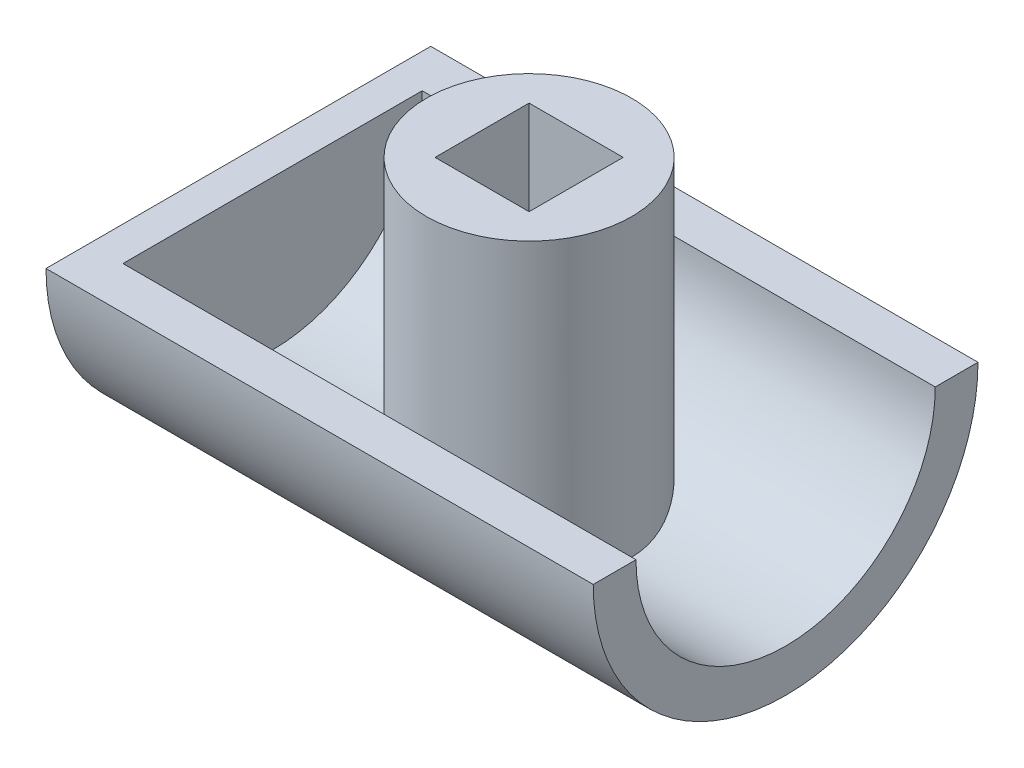
ISO-10303-21;
HEADER;
FILE_DESCRIPTION(('STEP AP214'),'2;1');
FILE_NAME('part.step','',(''),(''),'','','');
FILE_SCHEMA(('AUTOMOTIVE_DESIGN { 1 0 10303 214 1 1 1 1 }'));
ENDSEC;
DATA;
#1=APPLICATION_CONTEXT('core data for automotive mechanical design processes');
#2=APPLICATION_PROTOCOL_DEFINITION('international standard','automotive_design',2000,#1);
#3=PRODUCT_CONTEXT('',#1,'mechanical');
#4=PRODUCT('Part','Part','',(#3));
#5=PRODUCT_RELATED_PRODUCT_CATEGORY('part','',(#4));
#6=PRODUCT_DEFINITION_FORMATION('','',#4);
#7=PRODUCT_DEFINITION_CONTEXT('part definition',#1,'design');
#8=PRODUCT_DEFINITION('design','',#6,#7);
#9=PRODUCT_DEFINITION_SHAPE('','',#8);
#10=(LENGTH_UNIT() NAMED_UNIT(*) SI_UNIT(.MILLI.,.METRE.));
#11=(NAMED_UNIT(*) PLANE_ANGLE_UNIT() SI_UNIT($,.RADIAN.));
#12=(NAMED_UNIT(*) SI_UNIT($,.STERADIAN.) SOLID_ANGLE_UNIT());
#13=UNCERTAINTY_MEASURE_WITH_UNIT(LENGTH_MEASURE(1.E-05),#10,'distance_accuracy_value','');
#14=(GEOMETRIC_REPRESENTATION_CONTEXT(3) GLOBAL_UNCERTAINTY_ASSIGNED_CONTEXT((#13)) GLOBAL_UNIT_ASSIGNED_CONTEXT((#10,
#11,#12)) REPRESENTATION_CONTEXT('',''));
#15=CARTESIAN_POINT('',(0.,0.,0.));
#16=DIRECTION('',(0.,0.,1.));
#17=DIRECTION('',(1.,0.,0.));
#18=AXIS2_PLACEMENT_3D('',#15,#16,#17);
#19=CARTESIAN_POINT('',(-30.,0.,0.));
#20=DIRECTION('',(1.,0.,0.));
#21=DIRECTION('',(0.,0.,-1.));
#22=AXIS2_PLACEMENT_3D('',#19,#20,#21);
#23=CYLINDRICAL_SURFACE('',#22,17.5);
#24=DIRECTION('',(1.,0.,0.));
#25=VECTOR('',#24,1.);
#26=CARTESIAN_POINT('',(-30.,0.,17.5));
#27=LINE('',#26,#25);
#28=CARTESIAN_POINT('',(-30.,0.,17.5));
#29=VERTEX_POINT('',#28);
#30=CARTESIAN_POINT('',(30.,0.,17.5));
#31=VERTEX_POINT('',#30);
#32=EDGE_CURVE('E42',#29,#31,#27,.T.);
#33=ORIENTED_EDGE('',*,*,#32,.T.);
#34=CARTESIAN_POINT('',(30.,0.,0.));
#35=DIRECTION('',(-1.,0.,0.));
#36=DIRECTION('',(0.,0.,-1.));
#37=AXIS2_PLACEMENT_3D('',#34,#35,#36);
#38=CIRCLE('',#37,17.5);
#39=CARTESIAN_POINT('',(30.,0.,-17.5));
#40=VERTEX_POINT('',#39);
#41=EDGE_CURVE('E261',#40,#31,#38,.T.);
#42=ORIENTED_EDGE('',*,*,#41,.F.);
#43=DIRECTION('',(1.,0.,0.));
#44=VECTOR('',#43,1.);
#45=CARTESIAN_POINT('',(-30.,0.,-17.5));
#46=LINE('',#45,#44);
#47=CARTESIAN_POINT('',(-30.,0.,-17.5));
#48=VERTEX_POINT('',#47);
#49=EDGE_CURVE('E11',#48,#40,#46,.T.);
#50=ORIENTED_EDGE('',*,*,#49,.F.);
#51=CARTESIAN_POINT('',(-30.,0.,0.));
#52=DIRECTION('',(-1.,0.,0.));
#53=DIRECTION('',(0.,0.,-1.));
#54=AXIS2_PLACEMENT_3D('',#51,#52,#53);
#55=CIRCLE('',#54,17.5);
#56=EDGE_CURVE('E253',#48,#29,#55,.T.);
#57=ORIENTED_EDGE('',*,*,#56,.T.);
#58=EDGE_LOOP('',(#33,#42,#50,#57));
#59=FACE_BOUND('',#58,.T.);
#60=CARTESIAN_POINT('',(0.,-12.737739202857,12.));
#61=CARTESIAN_POINT('',(-0.290128718000152,-12.7377445552437,11.9999969887682));
#62=CARTESIAN_POINT('',(-0.580303393228295,-12.7476998280085,11.9894540006567));
#63=CARTESIAN_POINT('',(-1.15783558209898,-12.7870045379454,11.9475231044085));
#64=CARTESIAN_POINT('',(-1.44519243327409,-12.8163584297944,11.91613040836));
#65=CARTESIAN_POINT('',(-2.0149660191689,-12.893030832352,11.8331286055982));
#66=CARTESIAN_POINT('',(-2.29737437772336,-12.9403772053737,11.7814881401778));
#67=CARTESIAN_POINT('',(-2.85491815155481,-13.0508928347087,11.6589444870545));
#68=CARTESIAN_POINT('',(-3.13004972677914,-13.1140702680894,11.5880313430116));
#69=CARTESIAN_POINT('',(-3.66852508140652,-13.2529661999292,11.4289056809468));
#70=CARTESIAN_POINT('',(-3.93196459094716,-13.3285406591235,11.3408899286189));
#71=CARTESIAN_POINT('',(-4.44919962472427,-13.4901825322855,11.1481315348354));
#72=CARTESIAN_POINT('',(-4.70299586046192,-13.5762491701383,11.0433901304123));
#73=CARTESIAN_POINT('',(-5.44914547415945,-13.8465882535238,10.7053666510691));
#74=CARTESIAN_POINT('',(-5.92656118698327,-14.0430826770087,10.4481946578497));
#75=CARTESIAN_POINT('',(-6.64759162728568,-14.3660774618773,9.995402524265));
#76=CARTESIAN_POINT('',(-6.90578440245566,-14.4876544912226,9.8187411771711));
#77=CARTESIAN_POINT('',(-7.40700350957447,-14.7331582595515,9.44635945002832));
#78=CARTESIAN_POINT('',(-7.65002873734538,-14.857085168749,9.25063768505497));
#79=CARTESIAN_POINT('',(-8.12046323254589,-15.1046974373385,8.84056413228192));
#80=CARTESIAN_POINT('',(-8.34785508704561,-15.228382382941,8.62619215441852));
#81=CARTESIAN_POINT('',(-8.7859848278544,-15.4728956072697,8.1795071696121));
#82=CARTESIAN_POINT('',(-8.99672162964025,-15.5937236996085,7.94719299627562));
#83=CARTESIAN_POINT('',(-9.4323042460299,-15.8487368839796,7.42724829912026));
#84=CARTESIAN_POINT('',(-9.65416050460038,-15.9820359069522,7.13666288727971));
#85=CARTESIAN_POINT('',(-10.0723529709073,-16.2380716953773,6.53318225066571));
#86=CARTESIAN_POINT('',(-10.2686847391747,-16.3608066221677,6.22028315949516));
#87=CARTESIAN_POINT('',(-10.6332403719969,-16.5920456563585,5.5741870282377));
#88=CARTESIAN_POINT('',(-10.8015073080932,-16.7005715145592,5.24102218313327));
#89=CARTESIAN_POINT('',(-11.1077552544576,-16.9002586246598,4.5561311826985));
#90=CARTESIAN_POINT('',(-11.2457487310722,-16.991427022159,4.20441274186944));
#91=CARTESIAN_POINT('',(-11.4573071509782,-17.1322915264728,3.57896489040645));
#92=CARTESIAN_POINT('',(-11.5382933829426,-17.1866060120115,3.30875975677357));
#93=CARTESIAN_POINT('',(-11.6814083956392,-17.2830117794686,2.76128549284464));
#94=CARTESIAN_POINT('',(-11.7435410184715,-17.3251055517206,2.48401781429627));
#95=CARTESIAN_POINT('',(-11.8481241698842,-17.3961655422089,1.92430768173527));
#96=CARTESIAN_POINT('',(-11.8905867434532,-17.4251397939607,1.64186850495217));
#97=CARTESIAN_POINT('',(-11.955298450744,-17.4693617885921,1.0735981777293));
#98=CARTESIAN_POINT('',(-11.9775469097268,-17.484609073271,0.787766914385655));
#99=CARTESIAN_POINT('',(-12.0015232391073,-17.5010423455687,0.214328416734964));
#100=CARTESIAN_POINT('',(-12.0032145509425,-17.5022032822035,-0.0732810717513363));
#101=CARTESIAN_POINT('',(-11.9859570327073,-17.4903724056449,-0.647584193193073));
#102=CARTESIAN_POINT('',(-11.9670082794282,-17.4773806451066,-0.934277829551958));
#103=CARTESIAN_POINT('',(-11.9087431281857,-17.4375374458598,-1.50467578746819));
#104=CARTESIAN_POINT('',(-11.8694218363415,-17.4106826769922,-1.78837937404158));
#105=CARTESIAN_POINT('',(-11.7709636480241,-17.3437102230353,-2.35072368709382));
#106=CARTESIAN_POINT('',(-11.7118267001089,-17.3035925035149,-2.62936440042734));
#107=CARTESIAN_POINT('',(-11.5758816767167,-17.2118730199671,-3.17431287090238));
#108=CARTESIAN_POINT('',(-11.4994482207621,-17.1605153783963,-3.44075568098933));
#109=CARTESIAN_POINT('',(-11.3291712687666,-17.0468795501521,-3.96560187196048));
#110=CARTESIAN_POINT('',(-11.2353281222465,-16.984601582719,-4.22400541412116));
#111=CARTESIAN_POINT('',(-11.0311917274713,-16.8502607077459,-4.73155675631663));
#112=CARTESIAN_POINT('',(-10.9208999310375,-16.7781986638366,-4.9807053708052));
#113=CARTESIAN_POINT('',(-10.6847906564613,-16.6254817585812,-5.46889434665571));
#114=CARTESIAN_POINT('',(-10.5589675652917,-16.5448237921064,-5.70793101139546));
#115=CARTESIAN_POINT('',(-10.2778150874225,-16.3667452364989,-6.20128386375137));
#116=CARTESIAN_POINT('',(-10.1207590187404,-16.268459316145,-6.45430393629879));
#117=CARTESIAN_POINT('',(-9.78976493304936,-16.0646346284574,-6.94610784828059));
#118=CARTESIAN_POINT('',(-9.61581963361812,-15.959092738219,-7.1848854742742));
#119=CARTESIAN_POINT('',(-9.25196892512096,-15.7425388458006,-7.64773246695892));
#120=CARTESIAN_POINT('',(-9.06204804418399,-15.6315215849404,-7.87178719215708));
#121=CARTESIAN_POINT('',(-8.66734561648657,-15.4060588551205,-8.30438665788549));
#122=CARTESIAN_POINT('',(-8.46256837805909,-15.2916143856576,-8.51293585976425));
#123=CARTESIAN_POINT('',(-8.00223551448081,-15.0413514132136,-8.94881578856264));
#124=CARTESIAN_POINT('',(-7.74401463487898,-14.9052518877344,-9.1731790422404));
#125=CARTESIAN_POINT('',(-7.20889675026383,-14.6343750377142,-9.59941910285655));
#126=CARTESIAN_POINT('',(-6.93199601381346,-14.4995979835424,-9.80129139558034));
#127=CARTESIAN_POINT('',(-6.36031822558866,-14.2351478451623,-10.1815608074141));
#128=CARTESIAN_POINT('',(-6.0655461501758,-14.1054733565541,-10.3599644180323));
#129=CARTESIAN_POINT('',(-5.45873442767412,-13.8553750357588,-10.6921365982156));
#130=CARTESIAN_POINT('',(-5.14670016023636,-13.7349483491832,-10.845912785217));
#131=CARTESIAN_POINT('',(-4.58169885548291,-13.5347554958621,-11.0941202533743));
#132=CARTESIAN_POINT('',(-4.33214079556725,-13.4520951959362,-11.1939967356346));
#133=CARTESIAN_POINT('',(-3.8240392149765,-13.2971715669583,-11.3775944278251));
#134=CARTESIAN_POINT('',(-3.56549801071784,-13.2249055819452,-11.4613197665767));
#135=CARTESIAN_POINT('',(-3.04068602819205,-13.093180733608,-11.6115719606095));
#136=CARTESIAN_POINT('',(-2.77442745413285,-13.033702780565,-11.6781244812771));
#137=CARTESIAN_POINT('',(-2.23514718398209,-12.9296528974252,-11.7932231993707));
#138=CARTESIAN_POINT('',(-1.96212555922673,-12.8850808101742,-11.8417695866381));
#139=CARTESIAN_POINT('',(-1.40866529562038,-12.8124331882979,-11.9203383782992));
#140=CARTESIAN_POINT('',(-1.1281819495694,-12.784510210191,-11.9501895994831));
#141=CARTESIAN_POINT('',(-0.564570389588419,-12.7471448586396,-11.9900399215395));
#142=CARTESIAN_POINT('',(-0.281442240866178,-12.7377020307679,-12.000039510564));
#143=CARTESIAN_POINT('',(0.284787716327436,-12.7377765946127,-11.9999602562683));
#144=CARTESIAN_POINT('',(0.567889525271237,-12.747292682494,-11.9898827936791));
#145=CARTESIAN_POINT('',(1.13143016252285,-12.7847986438329,-11.9498814616061));
#146=CARTESIAN_POINT('',(1.41186906305103,-12.8127880148192,-11.9199581319275));
#147=CARTESIAN_POINT('',(1.9339281308719,-12.881438059821,-11.8457061566947));
#148=CARTESIAN_POINT('',(2.17612434026026,-12.9201456360063,-11.8035698805477));
#149=CARTESIAN_POINT('',(2.65540936508404,-13.0094459133029,-11.705072830191));
#150=CARTESIAN_POINT('',(2.89249629473982,-13.0600429233485,-11.6487068983587));
#151=CARTESIAN_POINT('',(3.59474728226576,-13.2274619814508,-11.4591752176553));
#152=CARTESIAN_POINT('',(4.05088514541339,-13.3599097280033,-11.3055779772214));
#153=CARTESIAN_POINT('',(4.8139763923523,-13.6136599405724,-10.9975710387458));
#154=CARTESIAN_POINT('',(5.12797106800265,-13.7283248553361,-10.854565924046));
#155=CARTESIAN_POINT('',(5.73951339800893,-13.968285383056,-10.5439803187681));
#156=CARTESIAN_POINT('',(6.03705470604677,-14.0935850514126,-10.3763904352598));
#157=CARTESIAN_POINT('',(6.61527521299404,-14.3507720698749,-10.0176907674546));
#158=CARTESIAN_POINT('',(6.89592647106354,-14.4826697088503,-9.82654352268974));
#159=CARTESIAN_POINT('',(7.43923355106066,-14.7491077407534,-9.42191582208135));
#160=CARTESIAN_POINT('',(7.70189137308496,-14.8836478378072,-9.20843785514214));
#161=CARTESIAN_POINT('',(8.21240625916903,-15.1540760792092,-8.75639330083958));
#162=CARTESIAN_POINT('',(8.45997025761576,-15.2899527272671,-8.51748868513805));
#163=CARTESIAN_POINT('',(8.93472206462877,-15.5576617832545,-8.01806933425983));
#164=CARTESIAN_POINT('',(9.1619083659137,-15.6894938915471,-7.75755300326376));
#165=CARTESIAN_POINT('',(9.59419312659028,-15.9457924690098,-7.21604566368356));
#166=CARTESIAN_POINT('',(9.79932110139035,-16.0702686777172,-6.93508288005691));
#167=CARTESIAN_POINT('',(10.1861029149922,-16.3090020539118,-6.35336424176625));
#168=CARTESIAN_POINT('',(10.3677616084454,-16.4232613332739,-6.0526124999628));
#169=CARTESIAN_POINT('',(10.6765957198717,-16.6201111745707,-5.48596193816029));
#170=CARTESIAN_POINT('',(10.8077693415956,-16.7047697231644,-5.22295493216429));
#171=CARTESIAN_POINT('',(11.0514477572855,-16.8634499522703,-4.68535611643493));
#172=CARTESIAN_POINT('',(11.1639559528224,-16.9374735705527,-4.41076642898472));
#173=CARTESIAN_POINT('',(11.369043527283,-17.0733492008583,-3.85143270084733));
#174=CARTESIAN_POINT('',(11.4616310930009,-17.1352062120995,-3.56669288786182));
#175=CARTESIAN_POINT('',(11.6257618416879,-17.2454236908095,-2.98863223597309));
#176=CARTESIAN_POINT('',(11.6973047874295,-17.2937840061351,-2.69531130037929));
#177=CARTESIAN_POINT('',(11.8186358973501,-17.3760799423619,-2.10057611146597));
#178=CARTESIAN_POINT('',(11.8683091084398,-17.409939317715,-1.79912772812398));
#179=CARTESIAN_POINT('',(11.9445721832114,-17.4620166843552,-1.19197317116968));
#180=CARTESIAN_POINT('',(11.9711619865168,-17.4802346347309,-0.886266986422874));
#181=CARTESIAN_POINT('',(12.0008120277911,-17.5005534946679,-0.273242336405395));
#182=CARTESIAN_POINT('',(12.0038771767333,-17.5026577680973,0.034075778955283));
#183=CARTESIAN_POINT('',(11.9864367919151,-17.4907010920432,0.647712815209691));
#184=CARTESIAN_POINT('',(11.9659326927066,-17.4766411264028,0.95403179577821));
#185=CARTESIAN_POINT('',(11.90447120192,-17.4346203251775,1.53685274550018));
#186=CARTESIAN_POINT('',(11.8654243323179,-17.4079588774051,1.81365354686608));
#187=CARTESIAN_POINT('',(11.7684657115168,-17.3420160665313,2.36237822945085));
#188=CARTESIAN_POINT('',(11.7105552477498,-17.3027355646772,2.63430244215885));
#189=CARTESIAN_POINT('',(11.5765850007967,-17.212346659672,3.17165131732491));
#190=CARTESIAN_POINT('',(11.5005230513875,-17.1612368448163,3.43707519985281));
#191=CARTESIAN_POINT('',(11.3311154413225,-17.0481729171485,3.9599704089993));
#192=CARTESIAN_POINT('',(11.2377688927727,-16.986218247255,4.21744132628825));
#193=CARTESIAN_POINT('',(11.0300988430849,-16.8495309119274,4.73477746880461));
#194=CARTESIAN_POINT('',(10.9150125817053,-16.774344217377,4.9942159711445));
#195=CARTESIAN_POINT('',(10.6680202964425,-16.6146855411922,5.50210204066454));
#196=CARTESIAN_POINT('',(10.5361073846577,-16.5302097590828,5.75054505048382));
#197=CARTESIAN_POINT('',(10.2565755662393,-16.3534588985878,6.23546077748582));
#198=CARTESIAN_POINT('',(10.1089589189456,-16.2611849425388,6.47193520941564));
#199=CARTESIAN_POINT('',(9.79896750642475,-16.0703095258263,6.93233520884888));
#200=CARTESIAN_POINT('',(9.63659099618986,-15.9717073174016,7.15625928749491));
#201=CARTESIAN_POINT('',(9.27127101663016,-15.7537837319415,7.62530485065932));
#202=CARTESIAN_POINT('',(9.0659661598497,-15.6336449941716,7.86821041372237));
#203=CARTESIAN_POINT('',(8.63787590426702,-15.3893468639703,8.33592412575024));
#204=CARTESIAN_POINT('',(8.41508889318517,-15.2651871013244,8.56073060165666));
#205=CARTESIAN_POINT('',(7.95243861378238,-15.0151027993819,8.99216214488609));
#206=CARTESIAN_POINT('',(7.71253960229374,-14.8891750352363,9.19874701285916));
#207=CARTESIAN_POINT('',(7.21679402632321,-14.6385238692728,9.59260731318427));
#208=CARTESIAN_POINT('',(6.9609472359888,-14.5138004845403,9.77988247197236));
#209=CARTESIAN_POINT('',(6.39690260904946,-14.2513011833899,10.1592706856018));
#210=CARTESIAN_POINT('',(6.08639080748247,-14.1141431534522,10.348389010789));
#211=CARTESIAN_POINT('',(5.44596467037214,-13.8500343412465,10.6992896530522));
#212=CARTESIAN_POINT('',(5.11604471012203,-13.7230865435052,10.8610639923901));
#213=CARTESIAN_POINT('',(4.43901786560652,-13.4853536834148,11.1548570817949));
#214=CARTESIAN_POINT('',(4.09197277708126,-13.3745154927178,11.2869744613277));
#215=CARTESIAN_POINT('',(3.38155103434684,-13.1745627897962,11.5197447739483));
#216=CARTESIAN_POINT('',(3.01818853755905,-13.0854298609006,11.6204244022368));
#217=CARTESIAN_POINT('',(2.43382410781009,-12.9664688095715,11.7526555355286));
#218=CARTESIAN_POINT('',(2.21717163539162,-12.9274599029922,11.7954768124544));
#219=CARTESIAN_POINT('',(1.78028871545376,-12.8597402017821,11.869271459263));
#220=CARTESIAN_POINT('',(1.56005920401678,-12.8310267568922,11.9002478783874));
#221=CARTESIAN_POINT('',(1.11715767667144,-12.7847396811168,11.9499619694777));
#222=CARTESIAN_POINT('',(0.894486857232027,-12.7671608215195,11.9687053860892));
#223=CARTESIAN_POINT('',(0.447886303809183,-12.7436597402163,11.9937242547595));
#224=CARTESIAN_POINT('',(0.223956844036344,-12.7377350712301,12.0000023244372));
#225=CARTESIAN_POINT('',(0.,-12.737739202857,12.));
#226=B_SPLINE_CURVE_WITH_KNOTS('',3,(#60,#61,#62,#63,#64,#65,#66,#67,#68,#69,#70,#71,#72,#73,
#74,#75,#76,#77,#78,#79,#80,#81,#82,#83,#84,#85,#86,#87,#88,#89,#90,#91,#92,#93,#94,#95,#96,#97,
#98,#99,#100,#101,#102,#103,#104,#105,#106,#107,#108,#109,#110,#111,#112,#113,#114,#115,#116,
#117,#118,#119,#120,#121,#122,#123,#124,#125,#126,#127,#128,#129,#130,#131,#132,#133,#134,#135,
#136,#137,#138,#139,#140,#141,#142,#143,#144,#145,#146,#147,#148,#149,#150,#151,#152,#153,#154,
#155,#156,#157,#158,#159,#160,#161,#162,#163,#164,#165,#166,#167,#168,#169,#170,#171,#172,#173,
#174,#175,#176,#177,#178,#179,#180,#181,#182,#183,#184,#185,#186,#187,#188,#189,#190,#191,#192,
#193,#194,#195,#196,#197,#198,#199,#200,#201,#202,#203,#204,#205,#206,#207,#208,#209,#210,#211,
#212,#213,#214,#215,#216,#217,#218,#219,#220,#221,#222,#223,#224,#225),.UNSPECIFIED.,.T.,.F.,(4,
2,2,2,2,2,2,2,2,2,2,2,2,2,2,2,2,2,2,2,2,2,2,2,2,2,2,2,2,2,2,2,2,2,2,2,2,2,2,2,2,2,2,2,2,2,2,2,2,
2,2,2,2,2,2,2,2,2,2,2,2,2,2,2,2,2,2,2,2,2,2,2,2,2,2,2,2,2,2,2,2,2,4),(0.,0.870111341675209,
1.74042256420127,2.61208703834438,3.48420267648697,4.34682255942314,5.20937867235412,
6.93352346290624,7.93975469350197,8.94605909119659,9.95346676688728,10.9609399877547,
12.1267841101601,13.2928307370677,14.4570710103062,15.62083095589,16.4817333387426,
17.3424601638086,18.2026592223045,19.0628869928415,19.9246443578609,20.7863985167234,
21.6483597817723,22.5103232845131,23.3551532890279,24.1999663343898,25.0447048573794,
25.8897495685885,26.8296365585012,27.7699306308821,28.7111460722963,29.6520896446534,
30.7553750766977,31.8588815543748,32.9620821541363,34.0649408643646,34.9079031559165,
35.7506496691536,36.5921292756882,37.4336000101274,38.2826671923225,39.1317134956811,
39.9807014107749,40.8296662344447,41.5754666421224,42.321537758645,43.8137296866565,
44.9032439836269,45.9931756330857,47.0848633928186,48.1764296062319,49.2849412714768,
50.3935348627345,51.5006261288497,52.6074880237822,53.5241460237348,54.4406367887955,
55.3567501805453,56.2728738988788,57.1937571322415,58.1146427742397,59.0353361682287,
59.9559735268063,60.797440275922,61.6388496073337,62.4803594039456,63.3219124401402,
64.2018613841054,65.0821716935037,65.9623555210778,66.8426435454355,67.861573297491,
68.8805971303316,69.9018155976893,70.9230485308357,72.0872850086112,73.2518605737969,
74.412503784303,75.5721587436469,76.2444472686776,76.9165626086406,77.5883620941817,
78.2600204925127),.UNSPECIFIED.);
#227=CARTESIAN_POINT('',(0.,-12.737739202857,12.));
#228=VERTEX_POINT('',#227);
#229=EDGE_CURVE('E163',#228,#228,#226,.T.);
#230=ORIENTED_EDGE('',*,*,#229,.T.);
#231=EDGE_LOOP('',(#230));
#232=FACE_BOUND('',#231,.T.);
#233=ADVANCED_FACE('F39',(#59,#232),#23,.F.);
#234=CARTESIAN_POINT('',(-30.,0.,-17.5));
#235=DIRECTION('',(0.,1.,0.));
#236=DIRECTION('',(0.,0.,1.));
#237=AXIS2_PLACEMENT_3D('',#234,#235,#236);
#238=PLANE('',#237);
#239=ORIENTED_EDGE('',*,*,#49,.T.);
#240=DIRECTION('',(0.,0.,1.));
#241=VECTOR('',#240,1.);
#242=CARTESIAN_POINT('',(30.,0.,-17.5));
#243=LINE('',#242,#241);
#244=CARTESIAN_POINT('',(30.,0.,-22.5));
#245=VERTEX_POINT('',#244);
#246=EDGE_CURVE('E247',#245,#40,#243,.T.);
#247=ORIENTED_EDGE('',*,*,#246,.F.);
#248=DIRECTION('',(1.,0.,0.));
#249=VECTOR('',#248,1.);
#250=CARTESIAN_POINT('',(-30.,0.,-22.5));
#251=LINE('',#250,#249);
#252=CARTESIAN_POINT('',(-34.,0.,-22.5));
#253=VERTEX_POINT('',#252);
#254=EDGE_CURVE('E48',#253,#245,#251,.T.);
#255=ORIENTED_EDGE('',*,*,#254,.F.);
#256=DIRECTION('',(0.,0.,-1.));
#257=VECTOR('',#256,1.);
#258=CARTESIAN_POINT('',(-34.,0.,-22.5));
#259=LINE('',#258,#257);
#260=CARTESIAN_POINT('',(-34.,0.,22.5));
#261=VERTEX_POINT('',#260);
#262=EDGE_CURVE('E159',#261,#253,#259,.T.);
#263=ORIENTED_EDGE('',*,*,#262,.F.);
#264=DIRECTION('',(1.,0.,0.));
#265=VECTOR('',#264,1.);
#266=CARTESIAN_POINT('',(-30.,0.,22.5));
#267=LINE('',#266,#265);
#268=CARTESIAN_POINT('',(30.,0.,22.5));
#269=VERTEX_POINT('',#268);
#270=EDGE_CURVE('E242',#261,#269,#267,.T.);
#271=ORIENTED_EDGE('',*,*,#270,.T.);
#272=DIRECTION('',(0.,0.,1.));
#273=VECTOR('',#272,1.);
#274=CARTESIAN_POINT('',(30.,0.,17.5));
#275=LINE('',#274,#273);
#276=EDGE_CURVE('E248',#31,#269,#275,.T.);
#277=ORIENTED_EDGE('',*,*,#276,.F.);
#278=ORIENTED_EDGE('',*,*,#32,.F.);
#279=DIRECTION('',(0.,0.,-1.));
#280=VECTOR('',#279,1.);
#281=CARTESIAN_POINT('',(-30.,0.,-22.5));
#282=LINE('',#281,#280);
#283=EDGE_CURVE('E63',#29,#48,#282,.T.);
#284=ORIENTED_EDGE('',*,*,#283,.T.);
#285=EDGE_LOOP('',(#239,#247,#255,#263,#271,#277,#278,#284));
#286=FACE_BOUND('',#285,.T.);
#287=ADVANCED_FACE('F204',(#286),#238,.T.);
#288=CARTESIAN_POINT('',(-30.,0.,0.));
#289=DIRECTION('',(1.,0.,0.));
#290=DIRECTION('',(0.,0.,-1.));
#291=AXIS2_PLACEMENT_3D('',#288,#289,#290);
#292=CYLINDRICAL_SURFACE('',#291,22.5);
#293=ORIENTED_EDGE('',*,*,#254,.T.);
#294=CARTESIAN_POINT('',(30.,0.,0.));
#295=DIRECTION('',(1.,0.,0.));
#296=DIRECTION('',(0.,0.,-1.));
#297=AXIS2_PLACEMENT_3D('',#294,#295,#296);
#298=CIRCLE('',#297,22.5);
#299=EDGE_CURVE('E238',#269,#245,#298,.T.);
#300=ORIENTED_EDGE('',*,*,#299,.F.);
#301=ORIENTED_EDGE('',*,*,#270,.F.);
#302=CARTESIAN_POINT('',(-34.,0.,0.));
#303=DIRECTION('',(-1.,0.,0.));
#304=DIRECTION('',(0.,0.,1.));
#305=AXIS2_PLACEMENT_3D('',#302,#303,#304);
#306=CIRCLE('',#305,22.5);
#307=EDGE_CURVE('E155',#253,#261,#306,.T.);
#308=ORIENTED_EDGE('',*,*,#307,.F.);
#309=EDGE_LOOP('',(#293,#300,#301,#308));
#310=FACE_BOUND('',#309,.T.);
#311=ADVANCED_FACE('F209',(#310),#292,.T.);
#312=CARTESIAN_POINT('',(30.,0.,0.));
#313=DIRECTION('',(1.,0.,0.));
#314=DIRECTION('',(0.,0.,-1.));
#315=AXIS2_PLACEMENT_3D('',#312,#313,#314);
#316=PLANE('',#315);
#317=ORIENTED_EDGE('',*,*,#41,.T.);
#318=ORIENTED_EDGE('',*,*,#276,.T.);
#319=ORIENTED_EDGE('',*,*,#299,.T.);
#320=ORIENTED_EDGE('',*,*,#246,.T.);
#321=EDGE_LOOP('',(#317,#318,#319,#320));
#322=FACE_BOUND('',#321,.T.);
#323=ADVANCED_FACE('F220',(#322),#316,.T.);
#324=CARTESIAN_POINT('',(0.,17.,0.));
#325=DIRECTION('',(0.,-1.,0.));
#326=DIRECTION('',(0.,0.,-1.));
#327=AXIS2_PLACEMENT_3D('',#324,#325,#326);
#328=CYLINDRICAL_SURFACE('',#327,12.);
#329=CARTESIAN_POINT('',(0.,17.,0.));
#330=DIRECTION('',(0.,1.,0.));
#331=DIRECTION('',(0.,0.,1.));
#332=AXIS2_PLACEMENT_3D('',#329,#330,#331);
#333=CIRCLE('',#332,12.);
#334=CARTESIAN_POINT('',(0.,17.,12.));
#335=VERTEX_POINT('',#334);
#336=EDGE_CURVE('E174',#335,#335,#333,.T.);
#337=ORIENTED_EDGE('',*,*,#336,.F.);
#338=EDGE_LOOP('',(#337));
#339=FACE_BOUND('',#338,.T.);
#340=ORIENTED_EDGE('',*,*,#229,.F.);
#341=EDGE_LOOP('',(#340));
#342=FACE_BOUND('',#341,.T.);
#343=ADVANCED_FACE('F218',(#339,#342),#328,.T.);
#344=CARTESIAN_POINT('',(0.,17.,0.));
#345=DIRECTION('',(0.,1.,0.));
#346=DIRECTION('',(0.,0.,1.));
#347=AXIS2_PLACEMENT_3D('',#344,#345,#346);
#348=PLANE('',#347);
#349=DIRECTION('',(0.,0.,1.));
#350=VECTOR('',#349,1.);
#351=CARTESIAN_POINT('',(-5.5,17.,5.5));
#352=LINE('',#351,#350);
#353=CARTESIAN_POINT('',(-5.5,17.,-5.5));
#354=VERTEX_POINT('',#353);
#355=CARTESIAN_POINT('',(-5.5,17.,5.5));
#356=VERTEX_POINT('',#355);
#357=EDGE_CURVE('E56',#354,#356,#352,.T.);
#358=ORIENTED_EDGE('',*,*,#357,.F.);
#359=DIRECTION('',(-1.,0.,0.));
#360=VECTOR('',#359,1.);
#361=CARTESIAN_POINT('',(5.5,17.,-5.5));
#362=LINE('',#361,#360);
#363=CARTESIAN_POINT('',(5.5,17.,-5.5));
#364=VERTEX_POINT('',#363);
#365=EDGE_CURVE('E128',#364,#354,#362,.T.);
#366=ORIENTED_EDGE('',*,*,#365,.F.);
#367=DIRECTION('',(0.,0.,-1.));
#368=VECTOR('',#367,1.);
#369=CARTESIAN_POINT('',(5.5,17.,5.5));
#370=LINE('',#369,#368);
#371=CARTESIAN_POINT('',(5.5,17.,5.5));
#372=VERTEX_POINT('',#371);
#373=EDGE_CURVE('E132',#372,#364,#370,.T.);
#374=ORIENTED_EDGE('',*,*,#373,.F.);
#375=DIRECTION('',(1.,0.,0.));
#376=VECTOR('',#375,1.);
#377=CARTESIAN_POINT('',(5.5,17.,5.5));
#378=LINE('',#377,#376);
#379=EDGE_CURVE('E141',#356,#372,#378,.T.);
#380=ORIENTED_EDGE('',*,*,#379,.F.);
#381=EDGE_LOOP('',(#358,#366,#374,#380));
#382=FACE_BOUND('',#381,.T.);
#383=ORIENTED_EDGE('',*,*,#336,.T.);
#384=EDGE_LOOP('',(#383));
#385=FACE_BOUND('',#384,.T.);
#386=ADVANCED_FACE('F184',(#382,#385),#348,.T.);
#387=CARTESIAN_POINT('',(-30.,0.,0.));
#388=DIRECTION('',(-1.,0.,0.));
#389=DIRECTION('',(0.,0.,1.));
#390=AXIS2_PLACEMENT_3D('',#387,#388,#389);
#391=PLANE('',#390);
#392=ORIENTED_EDGE('',*,*,#56,.F.);
#393=ORIENTED_EDGE('',*,*,#283,.F.);
#394=EDGE_LOOP('',(#392,#393));
#395=FACE_BOUND('',#394,.T.);
#396=ADVANCED_FACE('F180',(#395),#391,.F.);
#397=CARTESIAN_POINT('',(-34.,0.,0.));
#398=DIRECTION('',(-1.,0.,0.));
#399=DIRECTION('',(0.,0.,1.));
#400=AXIS2_PLACEMENT_3D('',#397,#398,#399);
#401=PLANE('',#400);
#402=ORIENTED_EDGE('',*,*,#307,.T.);
#403=ORIENTED_EDGE('',*,*,#262,.T.);
#404=EDGE_LOOP('',(#402,#403));
#405=FACE_BOUND('',#404,.T.);
#406=ADVANCED_FACE('F183',(#405),#401,.T.);
#407=CARTESIAN_POINT('',(-5.5,0.,5.5));
#408=DIRECTION('',(-1.,0.,0.));
#409=DIRECTION('',(0.,0.,1.));
#410=AXIS2_PLACEMENT_3D('',#407,#408,#409);
#411=PLANE('',#410);
#412=ORIENTED_EDGE('',*,*,#357,.T.);
#413=DIRECTION('',(0.,1.,0.));
#414=VECTOR('',#413,1.);
#415=CARTESIAN_POINT('',(-5.5,0.,5.5));
#416=LINE('',#415,#414);
#417=CARTESIAN_POINT('',(-5.5,0.,5.5));
#418=VERTEX_POINT('',#417);
#419=EDGE_CURVE('E103',#418,#356,#416,.T.);
#420=ORIENTED_EDGE('',*,*,#419,.F.);
#421=DIRECTION('',(0.,0.,1.));
#422=VECTOR('',#421,1.);
#423=CARTESIAN_POINT('',(-5.5,0.,5.5));
#424=LINE('',#423,#422);
#425=CARTESIAN_POINT('',(-5.5,0.,-5.5));
#426=VERTEX_POINT('',#425);
#427=EDGE_CURVE('E107',#426,#418,#424,.T.);
#428=ORIENTED_EDGE('',*,*,#427,.F.);
#429=DIRECTION('',(0.,1.,0.));
#430=VECTOR('',#429,1.);
#431=CARTESIAN_POINT('',(-5.5,0.,-5.5));
#432=LINE('',#431,#430);
#433=EDGE_CURVE('E147',#426,#354,#432,.T.);
#434=ORIENTED_EDGE('',*,*,#433,.T.);
#435=EDGE_LOOP('',(#412,#420,#428,#434));
#436=FACE_BOUND('',#435,.T.);
#437=ADVANCED_FACE('F105',(#436),#411,.F.);
#438=CARTESIAN_POINT('',(5.5,0.,-5.5));
#439=DIRECTION('',(0.,0.,-1.));
#440=DIRECTION('',(-1.,0.,0.));
#441=AXIS2_PLACEMENT_3D('',#438,#439,#440);
#442=PLANE('',#441);
#443=ORIENTED_EDGE('',*,*,#365,.T.);
#444=ORIENTED_EDGE('',*,*,#433,.F.);
#445=DIRECTION('',(-1.,0.,0.));
#446=VECTOR('',#445,1.);
#447=CARTESIAN_POINT('',(5.5,0.,-5.5));
#448=LINE('',#447,#446);
#449=CARTESIAN_POINT('',(5.5,0.,-5.5));
#450=VERTEX_POINT('',#449);
#451=EDGE_CURVE('E114',#450,#426,#448,.T.);
#452=ORIENTED_EDGE('',*,*,#451,.F.);
#453=DIRECTION('',(0.,1.,0.));
#454=VECTOR('',#453,1.);
#455=CARTESIAN_POINT('',(5.5,0.,-5.5));
#456=LINE('',#455,#454);
#457=EDGE_CURVE('E150',#450,#364,#456,.T.);
#458=ORIENTED_EDGE('',*,*,#457,.T.);
#459=EDGE_LOOP('',(#443,#444,#452,#458));
#460=FACE_BOUND('',#459,.T.);
#461=ADVANCED_FACE('F190',(#460),#442,.F.);
#462=CARTESIAN_POINT('',(5.5,0.,5.5));
#463=DIRECTION('',(1.,0.,0.));
#464=DIRECTION('',(0.,0.,-1.));
#465=AXIS2_PLACEMENT_3D('',#462,#463,#464);
#466=PLANE('',#465);
#467=ORIENTED_EDGE('',*,*,#373,.T.);
#468=ORIENTED_EDGE('',*,*,#457,.F.);
#469=DIRECTION('',(0.,0.,-1.));
#470=VECTOR('',#469,1.);
#471=CARTESIAN_POINT('',(5.5,0.,5.5));
#472=LINE('',#471,#470);
#473=CARTESIAN_POINT('',(5.5,0.,5.5));
#474=VERTEX_POINT('',#473);
#475=EDGE_CURVE('E123',#474,#450,#472,.T.);
#476=ORIENTED_EDGE('',*,*,#475,.F.);
#477=DIRECTION('',(0.,1.,0.));
#478=VECTOR('',#477,1.);
#479=CARTESIAN_POINT('',(5.5,0.,5.5));
#480=LINE('',#479,#478);
#481=EDGE_CURVE('E113',#474,#372,#480,.T.);
#482=ORIENTED_EDGE('',*,*,#481,.T.);
#483=EDGE_LOOP('',(#467,#468,#476,#482));
#484=FACE_BOUND('',#483,.T.);
#485=ADVANCED_FACE('F193',(#484),#466,.F.);
#486=CARTESIAN_POINT('',(5.5,0.,5.5));
#487=DIRECTION('',(0.,0.,1.));
#488=DIRECTION('',(1.,0.,0.));
#489=AXIS2_PLACEMENT_3D('',#486,#487,#488);
#490=PLANE('',#489);
#491=ORIENTED_EDGE('',*,*,#379,.T.);
#492=ORIENTED_EDGE('',*,*,#481,.F.);
#493=DIRECTION('',(1.,0.,0.));
#494=VECTOR('',#493,1.);
#495=CARTESIAN_POINT('',(5.5,0.,5.5));
#496=LINE('',#495,#494);
#497=EDGE_CURVE('E117',#418,#474,#496,.T.);
#498=ORIENTED_EDGE('',*,*,#497,.F.);
#499=ORIENTED_EDGE('',*,*,#419,.T.);
#500=EDGE_LOOP('',(#491,#492,#498,#499));
#501=FACE_BOUND('',#500,.T.);
#502=ADVANCED_FACE('F118',(#501),#490,.F.);
#503=CARTESIAN_POINT('',(0.,0.,0.));
#504=DIRECTION('',(0.,1.,0.));
#505=DIRECTION('',(0.,0.,1.));
#506=AXIS2_PLACEMENT_3D('',#503,#504,#505);
#507=PLANE('',#506);
#508=ORIENTED_EDGE('',*,*,#427,.T.);
#509=ORIENTED_EDGE('',*,*,#497,.T.);
#510=ORIENTED_EDGE('',*,*,#475,.T.);
#511=ORIENTED_EDGE('',*,*,#451,.T.);
#512=EDGE_LOOP('',(#508,#509,#510,#511));
#513=FACE_BOUND('',#512,.T.);
#514=ADVANCED_FACE('F125',(#513),#507,.T.);
#515=CLOSED_SHELL('',(#233,#287,#311,#323,#343,#386,#396,#406,#437,#461,#485,#502,#514));
#516=MANIFOLD_SOLID_BREP('B2',#515);
#517=ADVANCED_BREP_SHAPE_REPRESENTATION('',(#18,#516),#14);
#518=SHAPE_DEFINITION_REPRESENTATION(#9,#517);
ENDSEC;
END-ISO-10303-21;
